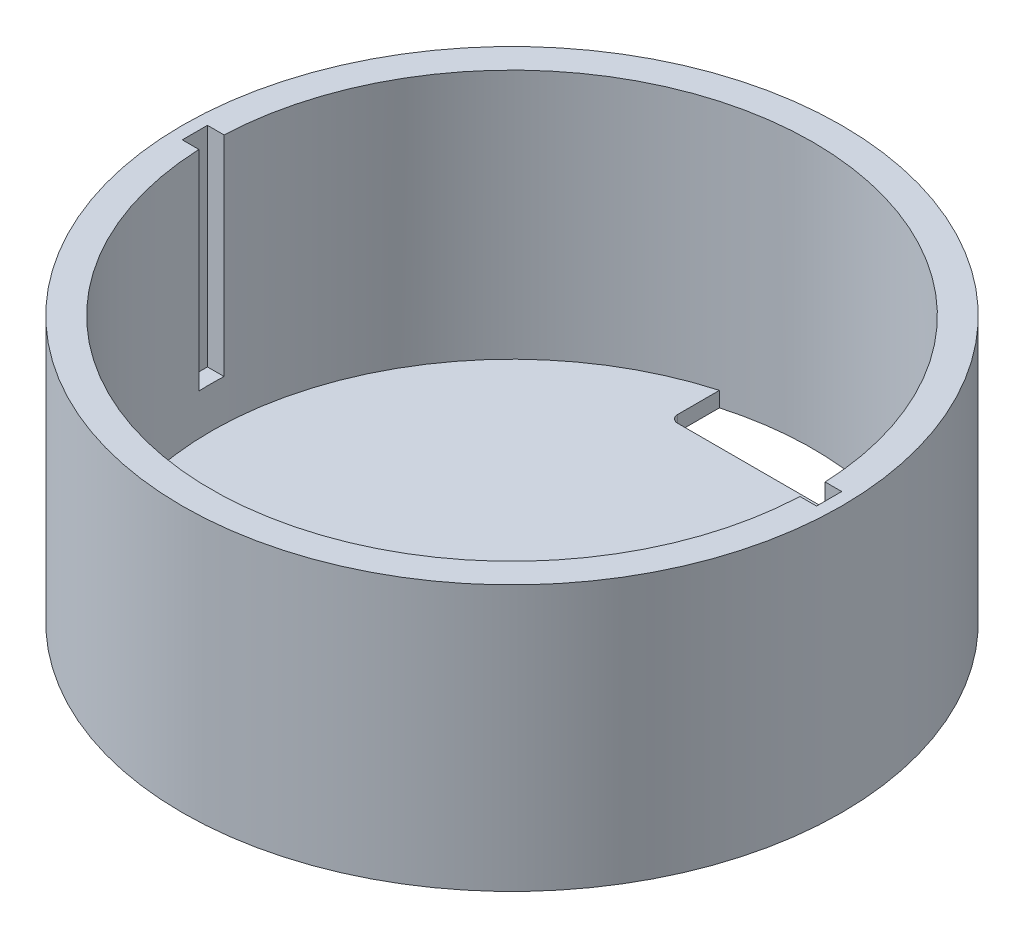
ISO-10303-21;
HEADER;
FILE_DESCRIPTION(('STEP AP214'),'2;1');
FILE_NAME('part.step','',(''),(''),'','','');
FILE_SCHEMA(('AUTOMOTIVE_DESIGN { 1 0 10303 214 1 1 1 1 }'));
ENDSEC;
DATA;
#1=APPLICATION_CONTEXT('core data for automotive mechanical design processes');
#2=APPLICATION_PROTOCOL_DEFINITION('international standard','automotive_design',2000,#1);
#3=PRODUCT_CONTEXT('',#1,'mechanical');
#4=PRODUCT('Part','Part','',(#3));
#5=PRODUCT_RELATED_PRODUCT_CATEGORY('part','',(#4));
#6=PRODUCT_DEFINITION_FORMATION('','',#4);
#7=PRODUCT_DEFINITION_CONTEXT('part definition',#1,'design');
#8=PRODUCT_DEFINITION('design','',#6,#7);
#9=PRODUCT_DEFINITION_SHAPE('','',#8);
#10=(LENGTH_UNIT() NAMED_UNIT(*) SI_UNIT(.MILLI.,.METRE.));
#11=(NAMED_UNIT(*) PLANE_ANGLE_UNIT() SI_UNIT($,.RADIAN.));
#12=(NAMED_UNIT(*) SI_UNIT($,.STERADIAN.) SOLID_ANGLE_UNIT());
#13=UNCERTAINTY_MEASURE_WITH_UNIT(LENGTH_MEASURE(1.E-05),#10,'distance_accuracy_value','');
#14=(GEOMETRIC_REPRESENTATION_CONTEXT(3) GLOBAL_UNCERTAINTY_ASSIGNED_CONTEXT((#13)) GLOBAL_UNIT_ASSIGNED_CONTEXT((#10,
#11,#12)) REPRESENTATION_CONTEXT('',''));
#15=CARTESIAN_POINT('',(0.,0.,0.));
#16=DIRECTION('',(0.,0.,1.));
#17=DIRECTION('',(1.,0.,0.));
#18=AXIS2_PLACEMENT_3D('',#15,#16,#17);
#19=CARTESIAN_POINT('',(0.,35.,0.));
#20=DIRECTION('',(0.,-1.,0.));
#21=DIRECTION('',(0.,0.,-1.));
#22=AXIS2_PLACEMENT_3D('',#19,#20,#21);
#23=CYLINDRICAL_SURFACE('',#22,39.6469113);
#24=CARTESIAN_POINT('',(0.,7.42155723603555,0.));
#25=DIRECTION('',(0.,1.,0.));
#26=DIRECTION('',(0.,0.,1.));
#27=AXIS2_PLACEMENT_3D('',#24,#25,#26);
#28=CIRCLE('',#27,39.6469113);
#29=CARTESIAN_POINT('',(-39.612178769447,7.42155723603555,-1.65917713564312));
#30=VERTEX_POINT('',#29);
#31=CARTESIAN_POINT('',(-39.612178769447,7.42155723603555,1.65917713564312));
#32=VERTEX_POINT('',#31);
#33=EDGE_CURVE('E172',#30,#32,#28,.T.);
#34=ORIENTED_EDGE('',*,*,#33,.T.);
#35=DIRECTION('',(0.,-1.,0.));
#36=VECTOR('',#35,1.);
#37=CARTESIAN_POINT('',(-39.612178769447,35.,1.65917713564312));
#38=LINE('',#37,#36);
#39=CARTESIAN_POINT('',(-39.612178769447,35.,1.65917713564312));
#40=VERTEX_POINT('',#39);
#41=EDGE_CURVE('E298',#40,#32,#38,.T.);
#42=ORIENTED_EDGE('',*,*,#41,.F.);
#43=CARTESIAN_POINT('',(0.,35.,0.));
#44=DIRECTION('',(0.,1.,0.));
#45=DIRECTION('',(0.,0.,1.));
#46=AXIS2_PLACEMENT_3D('',#43,#44,#45);
#47=CIRCLE('',#46,39.6469113);
#48=CARTESIAN_POINT('',(39.612178769447,35.,1.65917713564312));
#49=VERTEX_POINT('',#48);
#50=EDGE_CURVE('E261',#40,#49,#47,.T.);
#51=ORIENTED_EDGE('',*,*,#50,.T.);
#52=DIRECTION('',(0.,-1.,0.));
#53=VECTOR('',#52,1.);
#54=CARTESIAN_POINT('',(39.612178769447,35.,1.65917713564312));
#55=LINE('',#54,#53);
#56=CARTESIAN_POINT('',(39.612178769447,7.42155723603555,1.65917713564312));
#57=VERTEX_POINT('',#56);
#58=EDGE_CURVE('E302',#49,#57,#55,.T.);
#59=ORIENTED_EDGE('',*,*,#58,.T.);
#60=CARTESIAN_POINT('',(0.,7.42155723603555,0.));
#61=DIRECTION('',(0.,1.,0.));
#62=DIRECTION('',(0.,0.,1.));
#63=AXIS2_PLACEMENT_3D('',#60,#61,#62);
#64=CIRCLE('',#63,39.6469113);
#65=CARTESIAN_POINT('',(39.612178769447,7.42155723603555,-1.65917713564312));
#66=VERTEX_POINT('',#65);
#67=EDGE_CURVE('E241',#57,#66,#64,.T.);
#68=ORIENTED_EDGE('',*,*,#67,.T.);
#69=DIRECTION('',(0.,-1.,0.));
#70=VECTOR('',#69,1.);
#71=CARTESIAN_POINT('',(39.612178769447,35.,-1.65917713564312));
#72=LINE('',#71,#70);
#73=CARTESIAN_POINT('',(39.612178769447,35.,-1.65917713564312));
#74=VERTEX_POINT('',#73);
#75=EDGE_CURVE('E11',#74,#66,#72,.T.);
#76=ORIENTED_EDGE('',*,*,#75,.F.);
#77=CARTESIAN_POINT('',(-39.612178769447,35.,-1.65917713564312));
#78=VERTEX_POINT('',#77);
#79=EDGE_CURVE('E255',#74,#78,#47,.T.);
#80=ORIENTED_EDGE('',*,*,#79,.T.);
#81=DIRECTION('',(0.,-1.,0.));
#82=VECTOR('',#81,1.);
#83=CARTESIAN_POINT('',(-39.612178769447,35.,-1.65917713564312));
#84=LINE('',#83,#82);
#85=EDGE_CURVE('E281',#78,#30,#84,.T.);
#86=ORIENTED_EDGE('',*,*,#85,.T.);
#87=EDGE_LOOP('',(#34,#42,#51,#59,#68,#76,#80,#86));
#88=FACE_BOUND('',#87,.T.);
#89=CARTESIAN_POINT('',(0.,2.,0.));
#90=DIRECTION('',(0.,1.,0.));
#91=DIRECTION('',(0.,0.,1.));
#92=AXIS2_PLACEMENT_3D('',#89,#90,#91);
#93=CIRCLE('',#92,39.6469113);
#94=CARTESIAN_POINT('',(-10.8076312888475,2.,-38.1454149479907));
#95=VERTEX_POINT('',#94);
#96=CARTESIAN_POINT('',(11.6923687111525,2.,-37.8835860175951));
#97=VERTEX_POINT('',#96);
#98=EDGE_CURVE('E155',#95,#97,#93,.T.);
#99=ORIENTED_EDGE('',*,*,#98,.F.);
#100=DIRECTION('',(0.,-1.,0.));
#101=VECTOR('',#100,1.);
#102=CARTESIAN_POINT('',(-10.8076312888475,2.,-38.1454149479907));
#103=LINE('',#102,#101);
#104=CARTESIAN_POINT('',(-10.8076312888475,0.,-38.1454149479907));
#105=VERTEX_POINT('',#104);
#106=EDGE_CURVE('E165',#95,#105,#103,.T.);
#107=ORIENTED_EDGE('',*,*,#106,.T.);
#108=CARTESIAN_POINT('',(0.,0.,0.));
#109=DIRECTION('',(0.,1.,0.));
#110=DIRECTION('',(0.,0.,1.));
#111=AXIS2_PLACEMENT_3D('',#108,#109,#110);
#112=CIRCLE('',#111,39.6469113);
#113=CARTESIAN_POINT('',(11.6923687111525,0.,-37.8835860175951));
#114=VERTEX_POINT('',#113);
#115=EDGE_CURVE('E254',#114,#105,#112,.T.);
#116=ORIENTED_EDGE('',*,*,#115,.F.);
#117=DIRECTION('',(0.,-1.,0.));
#118=VECTOR('',#117,1.);
#119=CARTESIAN_POINT('',(11.6923687111525,2.,-37.8835860175951));
#120=LINE('',#119,#118);
#121=EDGE_CURVE('E173',#97,#114,#120,.T.);
#122=ORIENTED_EDGE('',*,*,#121,.F.);
#123=EDGE_LOOP('',(#99,#107,#116,#122));
#124=FACE_BOUND('',#123,.T.);
#125=ADVANCED_FACE('F48',(#88,#124),#23,.F.);
#126=CARTESIAN_POINT('',(0.,35.,-1.65917713564312));
#127=DIRECTION('',(0.,0.,-1.));
#128=DIRECTION('',(-1.,0.,0.));
#129=AXIS2_PLACEMENT_3D('',#126,#127,#128);
#130=PLANE('',#129);
#131=ORIENTED_EDGE('',*,*,#75,.T.);
#132=DIRECTION('',(1.,0.,0.));
#133=VECTOR('',#132,1.);
#134=CARTESIAN_POINT('',(0.,7.42155723603555,-1.65917713564312));
#135=LINE('',#134,#133);
#136=CARTESIAN_POINT('',(41.8009292669801,7.42155723603555,-1.65917713564312));
#137=VERTEX_POINT('',#136);
#138=EDGE_CURVE('E251',#66,#137,#135,.T.);
#139=ORIENTED_EDGE('',*,*,#138,.T.);
#140=DIRECTION('',(0.,-1.,0.));
#141=VECTOR('',#140,1.);
#142=CARTESIAN_POINT('',(41.8009292669801,35.,-1.65917713564312));
#143=LINE('',#142,#141);
#144=CARTESIAN_POINT('',(41.8009292669801,35.,-1.65917713564312));
#145=VERTEX_POINT('',#144);
#146=EDGE_CURVE('E57',#145,#137,#143,.T.);
#147=ORIENTED_EDGE('',*,*,#146,.F.);
#148=DIRECTION('',(1.,0.,0.));
#149=VECTOR('',#148,1.);
#150=CARTESIAN_POINT('',(0.,35.,-1.65917713564312));
#151=LINE('',#150,#149);
#152=EDGE_CURVE('E259',#74,#145,#151,.T.);
#153=ORIENTED_EDGE('',*,*,#152,.F.);
#154=EDGE_LOOP('',(#131,#139,#147,#153));
#155=FACE_BOUND('',#154,.T.);
#156=ADVANCED_FACE('F346',(#155),#130,.F.);
#157=CARTESIAN_POINT('',(41.8009292669801,35.,0.));
#158=DIRECTION('',(1.,0.,0.));
#159=DIRECTION('',(0.,0.,-1.));
#160=AXIS2_PLACEMENT_3D('',#157,#158,#159);
#161=PLANE('',#160);
#162=ORIENTED_EDGE('',*,*,#146,.T.);
#163=DIRECTION('',(0.,0.,1.));
#164=VECTOR('',#163,1.);
#165=CARTESIAN_POINT('',(41.8009292669801,7.42155723603555,0.));
#166=LINE('',#165,#164);
#167=CARTESIAN_POINT('',(41.8009292669801,7.42155723603555,1.65917713564312));
#168=VERTEX_POINT('',#167);
#169=EDGE_CURVE('E248',#137,#168,#166,.T.);
#170=ORIENTED_EDGE('',*,*,#169,.T.);
#171=DIRECTION('',(0.,-1.,0.));
#172=VECTOR('',#171,1.);
#173=CARTESIAN_POINT('',(41.8009292669801,35.,1.65917713564312));
#174=LINE('',#173,#172);
#175=CARTESIAN_POINT('',(41.8009292669801,35.,1.65917713564312));
#176=VERTEX_POINT('',#175);
#177=EDGE_CURVE('E306',#176,#168,#174,.T.);
#178=ORIENTED_EDGE('',*,*,#177,.F.);
#179=DIRECTION('',(0.,0.,1.));
#180=VECTOR('',#179,1.);
#181=CARTESIAN_POINT('',(41.8009292669801,35.,0.));
#182=LINE('',#181,#180);
#183=EDGE_CURVE('E264',#145,#176,#182,.T.);
#184=ORIENTED_EDGE('',*,*,#183,.F.);
#185=EDGE_LOOP('',(#162,#170,#178,#184));
#186=FACE_BOUND('',#185,.T.);
#187=ADVANCED_FACE('F50',(#186),#161,.F.);
#188=CARTESIAN_POINT('',(0.,35.,1.65917713564312));
#189=DIRECTION('',(0.,0.,-1.));
#190=DIRECTION('',(-1.,0.,0.));
#191=AXIS2_PLACEMENT_3D('',#188,#189,#190);
#192=PLANE('',#191);
#193=DIRECTION('',(1.,0.,0.));
#194=VECTOR('',#193,1.);
#195=CARTESIAN_POINT('',(0.,7.42155723603555,1.65917713564312));
#196=LINE('',#195,#194);
#197=EDGE_CURVE('E244',#57,#168,#196,.T.);
#198=ORIENTED_EDGE('',*,*,#197,.F.);
#199=ORIENTED_EDGE('',*,*,#58,.F.);
#200=DIRECTION('',(1.,0.,0.));
#201=VECTOR('',#200,1.);
#202=CARTESIAN_POINT('',(0.,35.,1.65917713564312));
#203=LINE('',#202,#201);
#204=EDGE_CURVE('E268',#49,#176,#203,.T.);
#205=ORIENTED_EDGE('',*,*,#204,.T.);
#206=ORIENTED_EDGE('',*,*,#177,.T.);
#207=EDGE_LOOP('',(#198,#199,#205,#206));
#208=FACE_BOUND('',#207,.T.);
#209=ADVANCED_FACE('F321',(#208),#192,.T.);
#210=DIRECTION('',(1.,0.,0.));
#211=VECTOR('',#210,1.);
#212=CARTESIAN_POINT('',(0.,7.42155723603555,1.65917713564312));
#213=LINE('',#212,#211);
#214=CARTESIAN_POINT('',(-41.8009292669801,7.42155723603555,1.65917713564312));
#215=VERTEX_POINT('',#214);
#216=EDGE_CURVE('E238',#215,#32,#213,.T.);
#217=ORIENTED_EDGE('',*,*,#216,.F.);
#218=DIRECTION('',(0.,-1.,0.));
#219=VECTOR('',#218,1.);
#220=CARTESIAN_POINT('',(-41.8009292669801,35.,1.65917713564312));
#221=LINE('',#220,#219);
#222=CARTESIAN_POINT('',(-41.8009292669801,35.,1.65917713564312));
#223=VERTEX_POINT('',#222);
#224=EDGE_CURVE('E294',#223,#215,#221,.T.);
#225=ORIENTED_EDGE('',*,*,#224,.F.);
#226=EDGE_CURVE('E272',#223,#40,#203,.T.);
#227=ORIENTED_EDGE('',*,*,#226,.T.);
#228=ORIENTED_EDGE('',*,*,#41,.T.);
#229=EDGE_LOOP('',(#217,#225,#227,#228));
#230=FACE_BOUND('',#229,.T.);
#231=ADVANCED_FACE('F333',(#230),#192,.T.);
#232=CARTESIAN_POINT('',(-41.8009292669801,35.,0.));
#233=DIRECTION('',(1.,0.,0.));
#234=DIRECTION('',(0.,0.,-1.));
#235=AXIS2_PLACEMENT_3D('',#232,#233,#234);
#236=PLANE('',#235);
#237=DIRECTION('',(0.,0.,1.));
#238=VECTOR('',#237,1.);
#239=CARTESIAN_POINT('',(-41.8009292669801,7.42155723603555,0.));
#240=LINE('',#239,#238);
#241=CARTESIAN_POINT('',(-41.8009292669801,7.42155723603555,-1.65917713564312));
#242=VERTEX_POINT('',#241);
#243=EDGE_CURVE('E235',#242,#215,#240,.T.);
#244=ORIENTED_EDGE('',*,*,#243,.F.);
#245=DIRECTION('',(0.,-1.,0.));
#246=VECTOR('',#245,1.);
#247=CARTESIAN_POINT('',(-41.8009292669801,35.,-1.65917713564312));
#248=LINE('',#247,#246);
#249=CARTESIAN_POINT('',(-41.8009292669801,35.,-1.65917713564312));
#250=VERTEX_POINT('',#249);
#251=EDGE_CURVE('E290',#250,#242,#248,.T.);
#252=ORIENTED_EDGE('',*,*,#251,.F.);
#253=DIRECTION('',(0.,0.,1.));
#254=VECTOR('',#253,1.);
#255=CARTESIAN_POINT('',(-41.8009292669801,35.,0.));
#256=LINE('',#255,#254);
#257=EDGE_CURVE('E273',#250,#223,#256,.T.);
#258=ORIENTED_EDGE('',*,*,#257,.T.);
#259=ORIENTED_EDGE('',*,*,#224,.T.);
#260=EDGE_LOOP('',(#244,#252,#258,#259));
#261=FACE_BOUND('',#260,.T.);
#262=ADVANCED_FACE('F340',(#261),#236,.T.);
#263=ORIENTED_EDGE('',*,*,#251,.T.);
#264=DIRECTION('',(1.,0.,0.));
#265=VECTOR('',#264,1.);
#266=CARTESIAN_POINT('',(0.,7.42155723603555,-1.65917713564312));
#267=LINE('',#266,#265);
#268=EDGE_CURVE('E231',#242,#30,#267,.T.);
#269=ORIENTED_EDGE('',*,*,#268,.T.);
#270=ORIENTED_EDGE('',*,*,#85,.F.);
#271=EDGE_CURVE('E265',#250,#78,#151,.T.);
#272=ORIENTED_EDGE('',*,*,#271,.F.);
#273=EDGE_LOOP('',(#263,#269,#270,#272));
#274=FACE_BOUND('',#273,.T.);
#275=ADVANCED_FACE('F344',(#274),#130,.F.);
#276=CARTESIAN_POINT('',(0.,35.,0.));
#277=DIRECTION('',(0.,-1.,0.));
#278=DIRECTION('',(0.,0.,-1.));
#279=AXIS2_PLACEMENT_3D('',#276,#277,#278);
#280=CYLINDRICAL_SURFACE('',#279,43.4563110942092);
#281=CARTESIAN_POINT('',(0.,35.,0.));
#282=DIRECTION('',(0.,1.,0.));
#283=DIRECTION('',(0.,0.,1.));
#284=AXIS2_PLACEMENT_3D('',#281,#282,#283);
#285=CIRCLE('',#284,43.4563110942092);
#286=CARTESIAN_POINT('',(0.,35.,43.4563110942092));
#287=VERTEX_POINT('',#286);
#288=EDGE_CURVE('E277',#287,#287,#285,.T.);
#289=ORIENTED_EDGE('',*,*,#288,.F.);
#290=EDGE_LOOP('',(#289));
#291=FACE_BOUND('',#290,.T.);
#292=CARTESIAN_POINT('',(0.,0.,0.));
#293=DIRECTION('',(0.,1.,0.));
#294=DIRECTION('',(0.,0.,1.));
#295=AXIS2_PLACEMENT_3D('',#292,#293,#294);
#296=CIRCLE('',#295,43.4563110942092);
#297=CARTESIAN_POINT('',(0.,0.,43.4563110942092));
#298=VERTEX_POINT('',#297);
#299=EDGE_CURVE('E260',#298,#298,#296,.T.);
#300=ORIENTED_EDGE('',*,*,#299,.T.);
#301=EDGE_LOOP('',(#300));
#302=FACE_BOUND('',#301,.T.);
#303=ADVANCED_FACE('F357',(#291,#302),#280,.T.);
#304=CARTESIAN_POINT('',(0.,35.,0.));
#305=DIRECTION('',(0.,1.,0.));
#306=DIRECTION('',(0.,0.,1.));
#307=AXIS2_PLACEMENT_3D('',#304,#305,#306);
#308=PLANE('',#307);
#309=ORIENTED_EDGE('',*,*,#79,.F.);
#310=ORIENTED_EDGE('',*,*,#152,.T.);
#311=ORIENTED_EDGE('',*,*,#183,.T.);
#312=ORIENTED_EDGE('',*,*,#204,.F.);
#313=ORIENTED_EDGE('',*,*,#50,.F.);
#314=ORIENTED_EDGE('',*,*,#226,.F.);
#315=ORIENTED_EDGE('',*,*,#257,.F.);
#316=ORIENTED_EDGE('',*,*,#271,.T.);
#317=EDGE_LOOP('',(#309,#310,#311,#312,#313,#314,#315,#316));
#318=FACE_BOUND('',#317,.T.);
#319=ORIENTED_EDGE('',*,*,#288,.T.);
#320=EDGE_LOOP('',(#319));
#321=FACE_BOUND('',#320,.T.);
#322=ADVANCED_FACE('F336',(#318,#321),#308,.T.);
#323=CARTESIAN_POINT('',(0.,0.,0.));
#324=DIRECTION('',(0.,1.,0.));
#325=DIRECTION('',(0.,0.,1.));
#326=AXIS2_PLACEMENT_3D('',#323,#324,#325);
#327=PLANE('',#326);
#328=ORIENTED_EDGE('',*,*,#115,.T.);
#329=DIRECTION('',(0.,0.,-1.));
#330=VECTOR('',#329,1.);
#331=CARTESIAN_POINT('',(-10.8076312888475,0.,0.));
#332=LINE('',#331,#330);
#333=CARTESIAN_POINT('',(-10.8076312888475,0.,-32.6359246282537));
#334=VERTEX_POINT('',#333);
#335=EDGE_CURVE('E168',#334,#105,#332,.T.);
#336=ORIENTED_EDGE('',*,*,#335,.F.);
#337=CARTESIAN_POINT('',(-9.80763128884749,0.,-32.6359246282537));
#338=DIRECTION('',(0.,1.,0.));
#339=DIRECTION('',(0.,0.,1.));
#340=AXIS2_PLACEMENT_3D('',#337,#338,#339);
#341=CIRCLE('',#340,1.);
#342=CARTESIAN_POINT('',(-9.80763128884749,0.,-31.6359246282537));
#343=VERTEX_POINT('',#342);
#344=EDGE_CURVE('E208',#334,#343,#341,.T.);
#345=ORIENTED_EDGE('',*,*,#344,.T.);
#346=DIRECTION('',(1.,0.,0.));
#347=VECTOR('',#346,1.);
#348=CARTESIAN_POINT('',(0.,0.,-31.6359246282537));
#349=LINE('',#348,#347);
#350=CARTESIAN_POINT('',(10.6923687111525,0.,-31.6359246282537));
#351=VERTEX_POINT('',#350);
#352=EDGE_CURVE('E204',#343,#351,#349,.T.);
#353=ORIENTED_EDGE('',*,*,#352,.T.);
#354=CARTESIAN_POINT('',(10.6923687111525,0.,-32.6359246282537));
#355=DIRECTION('',(0.,1.,0.));
#356=DIRECTION('',(0.,0.,1.));
#357=AXIS2_PLACEMENT_3D('',#354,#355,#356);
#358=CIRCLE('',#357,1.);
#359=CARTESIAN_POINT('',(11.6923687111525,0.,-32.6359246282537));
#360=VERTEX_POINT('',#359);
#361=EDGE_CURVE('E201',#351,#360,#358,.T.);
#362=ORIENTED_EDGE('',*,*,#361,.T.);
#363=DIRECTION('',(0.,0.,1.));
#364=VECTOR('',#363,1.);
#365=CARTESIAN_POINT('',(11.6923687111525,0.,0.));
#366=LINE('',#365,#364);
#367=EDGE_CURVE('E64',#114,#360,#366,.T.);
#368=ORIENTED_EDGE('',*,*,#367,.F.);
#369=EDGE_LOOP('',(#328,#336,#345,#353,#362,#368));
#370=FACE_BOUND('',#369,.T.);
#371=ORIENTED_EDGE('',*,*,#299,.F.);
#372=EDGE_LOOP('',(#371));
#373=FACE_BOUND('',#372,.T.);
#374=CARTESIAN_POINT('',(0.,0.,0.));
#375=DIRECTION('',(0.,1.,0.));
#376=DIRECTION('',(0.,0.,1.));
#377=AXIS2_PLACEMENT_3D('',#374,#375,#376);
#378=CIRCLE('',#377,4.75);
#379=CARTESIAN_POINT('',(0.,0.,4.75));
#380=VERTEX_POINT('',#379);
#381=EDGE_CURVE('E162',#380,#380,#378,.T.);
#382=ORIENTED_EDGE('',*,*,#381,.T.);
#383=EDGE_LOOP('',(#382));
#384=FACE_BOUND('',#383,.T.);
#385=ADVANCED_FACE('F408',(#370,#373,#384),#327,.F.);
#386=CARTESIAN_POINT('',(0.,7.42155723603555,0.));
#387=DIRECTION('',(0.,1.,0.));
#388=DIRECTION('',(0.,0.,1.));
#389=AXIS2_PLACEMENT_3D('',#386,#387,#388);
#390=PLANE('',#389);
#391=ORIENTED_EDGE('',*,*,#67,.F.);
#392=ORIENTED_EDGE('',*,*,#197,.T.);
#393=ORIENTED_EDGE('',*,*,#169,.F.);
#394=ORIENTED_EDGE('',*,*,#138,.F.);
#395=EDGE_LOOP('',(#391,#392,#393,#394));
#396=FACE_BOUND('',#395,.T.);
#397=ADVANCED_FACE('F319',(#396),#390,.T.);
#398=CARTESIAN_POINT('',(0.,7.42155723603555,0.));
#399=DIRECTION('',(0.,1.,0.));
#400=DIRECTION('',(0.,0.,1.));
#401=AXIS2_PLACEMENT_3D('',#398,#399,#400);
#402=PLANE('',#401);
#403=ORIENTED_EDGE('',*,*,#33,.F.);
#404=ORIENTED_EDGE('',*,*,#268,.F.);
#405=ORIENTED_EDGE('',*,*,#243,.T.);
#406=ORIENTED_EDGE('',*,*,#216,.T.);
#407=EDGE_LOOP('',(#403,#404,#405,#406));
#408=FACE_BOUND('',#407,.T.);
#409=ADVANCED_FACE('F423',(#408),#402,.T.);
#410=CARTESIAN_POINT('',(-10.8076312888475,2.,0.));
#411=DIRECTION('',(-1.,0.,0.));
#412=DIRECTION('',(0.,0.,1.));
#413=AXIS2_PLACEMENT_3D('',#410,#411,#412);
#414=PLANE('',#413);
#415=ORIENTED_EDGE('',*,*,#335,.T.);
#416=ORIENTED_EDGE('',*,*,#106,.F.);
#417=DIRECTION('',(0.,0.,-1.));
#418=VECTOR('',#417,1.);
#419=CARTESIAN_POINT('',(-10.8076312888475,2.,0.));
#420=LINE('',#419,#418);
#421=CARTESIAN_POINT('',(-10.8076312888475,2.,-32.6359246282537));
#422=VERTEX_POINT('',#421);
#423=EDGE_CURVE('E150',#422,#95,#420,.T.);
#424=ORIENTED_EDGE('',*,*,#423,.F.);
#425=DIRECTION('',(0.,-1.,0.));
#426=VECTOR('',#425,1.);
#427=CARTESIAN_POINT('',(-10.8076312888475,2.,-32.6359246282537));
#428=LINE('',#427,#426);
#429=EDGE_CURVE('E196',#422,#334,#428,.T.);
#430=ORIENTED_EDGE('',*,*,#429,.T.);
#431=EDGE_LOOP('',(#415,#416,#424,#430));
#432=FACE_BOUND('',#431,.T.);
#433=ADVANCED_FACE('F166',(#432),#414,.F.);
#434=CARTESIAN_POINT('',(11.6923687111525,2.,0.));
#435=DIRECTION('',(1.,0.,0.));
#436=DIRECTION('',(0.,0.,-1.));
#437=AXIS2_PLACEMENT_3D('',#434,#435,#436);
#438=PLANE('',#437);
#439=ORIENTED_EDGE('',*,*,#367,.T.);
#440=DIRECTION('',(0.,-1.,0.));
#441=VECTOR('',#440,1.);
#442=CARTESIAN_POINT('',(11.6923687111525,2.,-32.6359246282537));
#443=LINE('',#442,#441);
#444=CARTESIAN_POINT('',(11.6923687111525,2.,-32.6359246282537));
#445=VERTEX_POINT('',#444);
#446=EDGE_CURVE('E223',#445,#360,#443,.T.);
#447=ORIENTED_EDGE('',*,*,#446,.F.);
#448=DIRECTION('',(0.,0.,1.));
#449=VECTOR('',#448,1.);
#450=CARTESIAN_POINT('',(11.6923687111525,2.,0.));
#451=LINE('',#450,#449);
#452=EDGE_CURVE('E177',#97,#445,#451,.T.);
#453=ORIENTED_EDGE('',*,*,#452,.F.);
#454=ORIENTED_EDGE('',*,*,#121,.T.);
#455=EDGE_LOOP('',(#439,#447,#453,#454));
#456=FACE_BOUND('',#455,.T.);
#457=ADVANCED_FACE('F449',(#456),#438,.F.);
#458=CARTESIAN_POINT('',(10.6923687111525,2.,-32.6359246282537));
#459=DIRECTION('',(0.,-1.,0.));
#460=DIRECTION('',(0.,0.,-1.));
#461=AXIS2_PLACEMENT_3D('',#458,#459,#460);
#462=CYLINDRICAL_SURFACE('',#461,1.);
#463=ORIENTED_EDGE('',*,*,#361,.F.);
#464=DIRECTION('',(0.,-1.,0.));
#465=VECTOR('',#464,1.);
#466=CARTESIAN_POINT('',(10.6923687111525,2.,-31.6359246282537));
#467=LINE('',#466,#465);
#468=CARTESIAN_POINT('',(10.6923687111525,2.,-31.6359246282537));
#469=VERTEX_POINT('',#468);
#470=EDGE_CURVE('E220',#469,#351,#467,.T.);
#471=ORIENTED_EDGE('',*,*,#470,.F.);
#472=CARTESIAN_POINT('',(10.6923687111525,2.,-32.6359246282537));
#473=DIRECTION('',(0.,1.,0.));
#474=DIRECTION('',(0.,0.,1.));
#475=AXIS2_PLACEMENT_3D('',#472,#473,#474);
#476=CIRCLE('',#475,1.);
#477=EDGE_CURVE('E180',#469,#445,#476,.T.);
#478=ORIENTED_EDGE('',*,*,#477,.T.);
#479=ORIENTED_EDGE('',*,*,#446,.T.);
#480=EDGE_LOOP('',(#463,#471,#478,#479));
#481=FACE_BOUND('',#480,.T.);
#482=ADVANCED_FACE('F458',(#481),#462,.F.);
#483=CARTESIAN_POINT('',(0.,2.,-31.6359246282537));
#484=DIRECTION('',(0.,0.,-1.));
#485=DIRECTION('',(-1.,0.,0.));
#486=AXIS2_PLACEMENT_3D('',#483,#484,#485);
#487=PLANE('',#486);
#488=ORIENTED_EDGE('',*,*,#352,.F.);
#489=DIRECTION('',(0.,-1.,0.));
#490=VECTOR('',#489,1.);
#491=CARTESIAN_POINT('',(-9.80763128884749,2.,-31.6359246282537));
#492=LINE('',#491,#490);
#493=CARTESIAN_POINT('',(-9.80763128884749,2.,-31.6359246282537));
#494=VERTEX_POINT('',#493);
#495=EDGE_CURVE('E217',#494,#343,#492,.T.);
#496=ORIENTED_EDGE('',*,*,#495,.F.);
#497=DIRECTION('',(1.,0.,0.));
#498=VECTOR('',#497,1.);
#499=CARTESIAN_POINT('',(0.,2.,-31.6359246282537));
#500=LINE('',#499,#498);
#501=EDGE_CURVE('E186',#494,#469,#500,.T.);
#502=ORIENTED_EDGE('',*,*,#501,.T.);
#503=ORIENTED_EDGE('',*,*,#470,.T.);
#504=EDGE_LOOP('',(#488,#496,#502,#503));
#505=FACE_BOUND('',#504,.T.);
#506=ADVANCED_FACE('F468',(#505),#487,.T.);
#507=CARTESIAN_POINT('',(-9.80763128884749,2.,-32.6359246282537));
#508=DIRECTION('',(0.,-1.,0.));
#509=DIRECTION('',(0.,0.,-1.));
#510=AXIS2_PLACEMENT_3D('',#507,#508,#509);
#511=CYLINDRICAL_SURFACE('',#510,1.);
#512=ORIENTED_EDGE('',*,*,#344,.F.);
#513=ORIENTED_EDGE('',*,*,#429,.F.);
#514=CARTESIAN_POINT('',(-9.80763128884749,2.,-32.6359246282537));
#515=DIRECTION('',(0.,1.,0.));
#516=DIRECTION('',(0.,0.,1.));
#517=AXIS2_PLACEMENT_3D('',#514,#515,#516);
#518=CIRCLE('',#517,1.);
#519=EDGE_CURVE('E159',#422,#494,#518,.T.);
#520=ORIENTED_EDGE('',*,*,#519,.T.);
#521=ORIENTED_EDGE('',*,*,#495,.T.);
#522=EDGE_LOOP('',(#512,#513,#520,#521));
#523=FACE_BOUND('',#522,.T.);
#524=ADVANCED_FACE('F477',(#523),#511,.F.);
#525=CARTESIAN_POINT('',(0.,2.,0.));
#526=DIRECTION('',(0.,-1.,0.));
#527=DIRECTION('',(0.,0.,-1.));
#528=AXIS2_PLACEMENT_3D('',#525,#526,#527);
#529=CYLINDRICAL_SURFACE('',#528,4.75);
#530=CARTESIAN_POINT('',(0.,2.,0.));
#531=DIRECTION('',(0.,1.,0.));
#532=DIRECTION('',(0.,0.,1.));
#533=AXIS2_PLACEMENT_3D('',#530,#531,#532);
#534=CIRCLE('',#533,4.75);
#535=CARTESIAN_POINT('',(0.,2.,4.75));
#536=VERTEX_POINT('',#535);
#537=EDGE_CURVE('E192',#536,#536,#534,.T.);
#538=ORIENTED_EDGE('',*,*,#537,.T.);
#539=EDGE_LOOP('',(#538));
#540=FACE_BOUND('',#539,.T.);
#541=ORIENTED_EDGE('',*,*,#381,.F.);
#542=EDGE_LOOP('',(#541));
#543=FACE_BOUND('',#542,.T.);
#544=ADVANCED_FACE('F486',(#540,#543),#529,.F.);
#545=CARTESIAN_POINT('',(0.,2.,0.));
#546=DIRECTION('',(0.,1.,0.));
#547=DIRECTION('',(0.,0.,1.));
#548=AXIS2_PLACEMENT_3D('',#545,#546,#547);
#549=PLANE('',#548);
#550=ORIENTED_EDGE('',*,*,#423,.T.);
#551=ORIENTED_EDGE('',*,*,#98,.T.);
#552=ORIENTED_EDGE('',*,*,#452,.T.);
#553=ORIENTED_EDGE('',*,*,#477,.F.);
#554=ORIENTED_EDGE('',*,*,#501,.F.);
#555=ORIENTED_EDGE('',*,*,#519,.F.);
#556=EDGE_LOOP('',(#550,#551,#552,#553,#554,#555));
#557=FACE_BOUND('',#556,.T.);
#558=ORIENTED_EDGE('',*,*,#537,.F.);
#559=EDGE_LOOP('',(#558));
#560=FACE_BOUND('',#559,.T.);
#561=ADVANCED_FACE('F152',(#557,#560),#549,.T.);
#562=CLOSED_SHELL('',(#125,#156,#187,#209,#231,#262,#275,#303,#322,#385,#397,#409,#433,#457,
#482,#506,#524,#544,#561));
#563=MANIFOLD_SOLID_BREP('B2',#562);
#564=ADVANCED_BREP_SHAPE_REPRESENTATION('',(#18,#563),#14);
#565=SHAPE_DEFINITION_REPRESENTATION(#9,#564);
ENDSEC;
END-ISO-10303-21;
